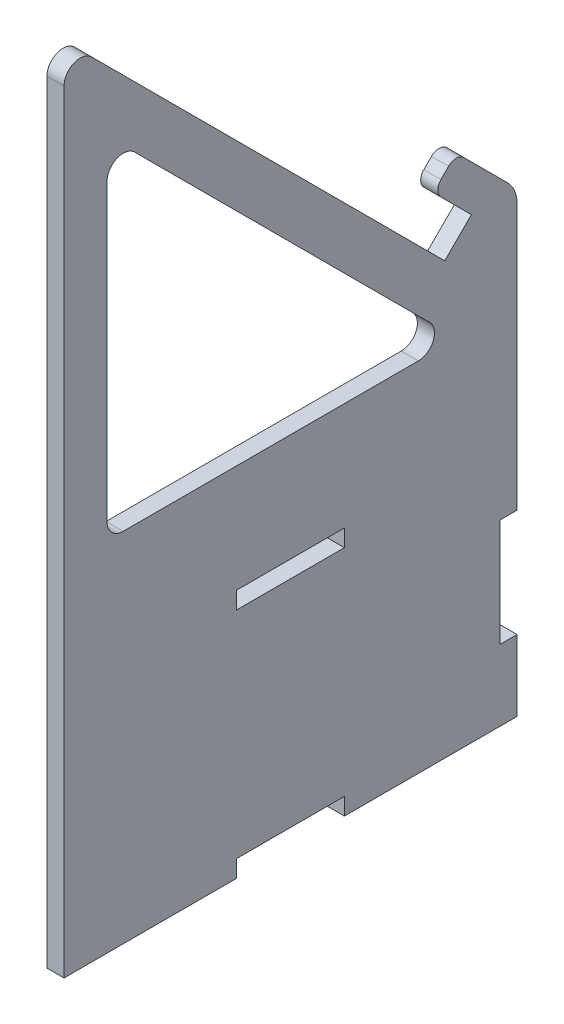
ISO-10303-21;
HEADER;
FILE_DESCRIPTION(('STEP AP214'),'2;1');
FILE_NAME('part.step','',(''),(''),'','','');
FILE_SCHEMA(('AUTOMOTIVE_DESIGN { 1 0 10303 214 1 1 1 1 }'));
ENDSEC;
DATA;
#1=APPLICATION_CONTEXT('core data for automotive mechanical design processes');
#2=APPLICATION_PROTOCOL_DEFINITION('international standard','automotive_design',2000,#1);
#3=PRODUCT_CONTEXT('',#1,'mechanical');
#4=PRODUCT('Part','Part','',(#3));
#5=PRODUCT_RELATED_PRODUCT_CATEGORY('part','',(#4));
#6=PRODUCT_DEFINITION_FORMATION('','',#4);
#7=PRODUCT_DEFINITION_CONTEXT('part definition',#1,'design');
#8=PRODUCT_DEFINITION('design','',#6,#7);
#9=PRODUCT_DEFINITION_SHAPE('','',#8);
#10=(LENGTH_UNIT() NAMED_UNIT(*) SI_UNIT(.MILLI.,.METRE.));
#11=(NAMED_UNIT(*) PLANE_ANGLE_UNIT() SI_UNIT($,.RADIAN.));
#12=(NAMED_UNIT(*) SI_UNIT($,.STERADIAN.) SOLID_ANGLE_UNIT());
#13=UNCERTAINTY_MEASURE_WITH_UNIT(LENGTH_MEASURE(1.E-05),#10,'distance_accuracy_value','');
#14=(GEOMETRIC_REPRESENTATION_CONTEXT(3) GLOBAL_UNCERTAINTY_ASSIGNED_CONTEXT((#13)) GLOBAL_UNIT_ASSIGNED_CONTEXT((#10,
#11,#12)) REPRESENTATION_CONTEXT('',''));
#15=CARTESIAN_POINT('',(0.,0.,0.));
#16=DIRECTION('',(0.,0.,1.));
#17=DIRECTION('',(1.,0.,0.));
#18=AXIS2_PLACEMENT_3D('',#15,#16,#17);
#19=CARTESIAN_POINT('',(3.175,0.,42.0728534805994));
#20=DIRECTION('',(0.,1.,0.));
#21=DIRECTION('',(0.,0.,1.));
#22=AXIS2_PLACEMENT_3D('',#19,#20,#21);
#23=PLANE('',#22);
#24=DIRECTION('',(0.,0.,-1.));
#25=VECTOR('',#24,1.);
#26=CARTESIAN_POINT('',(0.,0.,42.0728534805994));
#27=LINE('',#26,#25);
#28=CARTESIAN_POINT('',(0.,0.,42.0728534805994));
#29=VERTEX_POINT('',#28);
#30=CARTESIAN_POINT('',(0.,0.,10.));
#31=VERTEX_POINT('',#30);
#32=EDGE_CURVE('E255',#29,#31,#27,.T.);
#33=ORIENTED_EDGE('',*,*,#32,.T.);
#34=DIRECTION('',(1.,0.,0.));
#35=VECTOR('',#34,1.);
#36=CARTESIAN_POINT('',(0.,0.,10.));
#37=LINE('',#36,#35);
#38=CARTESIAN_POINT('',(3.175,0.,10.));
#39=VERTEX_POINT('',#38);
#40=EDGE_CURVE('E238',#31,#39,#37,.T.);
#41=ORIENTED_EDGE('',*,*,#40,.T.);
#42=DIRECTION('',(0.,0.,-1.));
#43=VECTOR('',#42,1.);
#44=CARTESIAN_POINT('',(3.175,0.,42.0728534805994));
#45=LINE('',#44,#43);
#46=CARTESIAN_POINT('',(3.175,0.,42.0728534805994));
#47=VERTEX_POINT('',#46);
#48=EDGE_CURVE('E545',#47,#39,#45,.T.);
#49=ORIENTED_EDGE('',*,*,#48,.F.);
#50=DIRECTION('',(-1.,0.,0.));
#51=VECTOR('',#50,1.);
#52=CARTESIAN_POINT('',(3.175,0.,42.0728534805994));
#53=LINE('',#52,#51);
#54=EDGE_CURVE('E263',#47,#29,#53,.T.);
#55=ORIENTED_EDGE('',*,*,#54,.T.);
#56=EDGE_LOOP('',(#33,#41,#49,#55));
#57=FACE_BOUND('',#56,.T.);
#58=ADVANCED_FACE('F39',(#57),#23,.F.);
#59=CARTESIAN_POINT('',(3.175,0.,-42.0728534805994));
#60=DIRECTION('',(0.,0.,1.));
#61=DIRECTION('',(0.,-1.,0.));
#62=AXIS2_PLACEMENT_3D('',#59,#60,#61);
#63=PLANE('',#62);
#64=DIRECTION('',(0.,1.,0.));
#65=VECTOR('',#64,1.);
#66=CARTESIAN_POINT('',(0.,0.,-42.0728534805994));
#67=LINE('',#66,#65);
#68=CARTESIAN_POINT('',(0.,0.,-42.0728534805994));
#69=VERTEX_POINT('',#68);
#70=CARTESIAN_POINT('',(0.,13.175,-42.0728534805994));
#71=VERTEX_POINT('',#70);
#72=EDGE_CURVE('E271',#69,#71,#67,.T.);
#73=ORIENTED_EDGE('',*,*,#72,.T.);
#74=DIRECTION('',(1.,0.,0.));
#75=VECTOR('',#74,1.);
#76=CARTESIAN_POINT('',(0.,13.175,-42.0728534805994));
#77=LINE('',#76,#75);
#78=CARTESIAN_POINT('',(3.175,13.175,-42.0728534805994));
#79=VERTEX_POINT('',#78);
#80=EDGE_CURVE('E486',#71,#79,#77,.T.);
#81=ORIENTED_EDGE('',*,*,#80,.T.);
#82=DIRECTION('',(0.,1.,0.));
#83=VECTOR('',#82,1.);
#84=CARTESIAN_POINT('',(3.175,0.,-42.0728534805994));
#85=LINE('',#84,#83);
#86=CARTESIAN_POINT('',(3.175,0.,-42.0728534805994));
#87=VERTEX_POINT('',#86);
#88=EDGE_CURVE('E549',#87,#79,#85,.T.);
#89=ORIENTED_EDGE('',*,*,#88,.F.);
#90=DIRECTION('',(-1.,0.,0.));
#91=VECTOR('',#90,1.);
#92=CARTESIAN_POINT('',(3.175,0.,-42.0728534805994));
#93=LINE('',#92,#91);
#94=EDGE_CURVE('E306',#87,#69,#93,.T.);
#95=ORIENTED_EDGE('',*,*,#94,.T.);
#96=EDGE_LOOP('',(#73,#81,#89,#95));
#97=FACE_BOUND('',#96,.T.);
#98=ADVANCED_FACE('F593',(#97),#63,.F.);
#99=CARTESIAN_POINT('',(3.175,150.710678118654,42.0728534805994));
#100=DIRECTION('',(0.,0.,-1.));
#101=DIRECTION('',(0.,1.,0.));
#102=AXIS2_PLACEMENT_3D('',#99,#100,#101);
#103=PLANE('',#102);
#104=DIRECTION('',(0.,-1.,0.));
#105=VECTOR('',#104,1.);
#106=CARTESIAN_POINT('',(3.175,150.710678118654,42.0728534805994));
#107=LINE('',#106,#105);
#108=CARTESIAN_POINT('',(3.175,143.468037431535,42.0728534805994));
#109=VERTEX_POINT('',#108);
#110=EDGE_CURVE('E296',#109,#47,#107,.T.);
#111=ORIENTED_EDGE('',*,*,#110,.F.);
#112=DIRECTION('',(-1.,0.,0.));
#113=VECTOR('',#112,1.);
#114=CARTESIAN_POINT('',(3.175,143.468037431535,42.0728534805994));
#115=LINE('',#114,#113);
#116=CARTESIAN_POINT('',(0.,143.468037431535,42.0728534805994));
#117=VERTEX_POINT('',#116);
#118=EDGE_CURVE('E372',#109,#117,#115,.T.);
#119=ORIENTED_EDGE('',*,*,#118,.T.);
#120=DIRECTION('',(0.,-1.,0.));
#121=VECTOR('',#120,1.);
#122=CARTESIAN_POINT('',(0.,150.710678118654,42.0728534805994));
#123=LINE('',#122,#121);
#124=EDGE_CURVE('E273',#117,#29,#123,.T.);
#125=ORIENTED_EDGE('',*,*,#124,.T.);
#126=ORIENTED_EDGE('',*,*,#54,.F.);
#127=EDGE_LOOP('',(#111,#119,#125,#126));
#128=FACE_BOUND('',#127,.T.);
#129=ADVANCED_FACE('F575',(#128),#103,.F.);
#130=CARTESIAN_POINT('',(3.175,0.,-10.));
#131=VERTEX_POINT('',#130);
#132=EDGE_CURVE('E544',#131,#87,#45,.T.);
#133=ORIENTED_EDGE('',*,*,#132,.F.);
#134=DIRECTION('',(1.,0.,0.));
#135=VECTOR('',#134,1.);
#136=CARTESIAN_POINT('',(0.,0.,-10.));
#137=LINE('',#136,#135);
#138=CARTESIAN_POINT('',(0.,0.,-10.));
#139=VERTEX_POINT('',#138);
#140=EDGE_CURVE('E250',#139,#131,#137,.T.);
#141=ORIENTED_EDGE('',*,*,#140,.F.);
#142=EDGE_CURVE('E266',#139,#69,#27,.T.);
#143=ORIENTED_EDGE('',*,*,#142,.T.);
#144=ORIENTED_EDGE('',*,*,#94,.F.);
#145=EDGE_LOOP('',(#133,#141,#143,#144));
#146=FACE_BOUND('',#145,.T.);
#147=ADVANCED_FACE('F588',(#146),#23,.F.);
#148=CARTESIAN_POINT('',(0.,33.175,-42.0728534805994));
#149=VERTEX_POINT('',#148);
#150=CARTESIAN_POINT('',(0.,82.4644660940667,-42.0728534805994));
#151=VERTEX_POINT('',#150);
#152=EDGE_CURVE('E265',#149,#151,#67,.T.);
#153=ORIENTED_EDGE('',*,*,#152,.T.);
#154=DIRECTION('',(-1.,0.,0.));
#155=VECTOR('',#154,1.);
#156=CARTESIAN_POINT('',(3.175,82.4644660940667,-42.0728534805994));
#157=LINE('',#156,#155);
#158=CARTESIAN_POINT('',(3.175,82.4644660940667,-42.0728534805994));
#159=VERTEX_POINT('',#158);
#160=EDGE_CURVE('E319',#151,#159,#157,.F.);
#161=ORIENTED_EDGE('',*,*,#160,.T.);
#162=CARTESIAN_POINT('',(3.175,33.175,-42.0728534805994));
#163=VERTEX_POINT('',#162);
#164=EDGE_CURVE('E548',#163,#159,#85,.T.);
#165=ORIENTED_EDGE('',*,*,#164,.F.);
#166=DIRECTION('',(1.,0.,0.));
#167=VECTOR('',#166,1.);
#168=CARTESIAN_POINT('',(0.,33.175,-42.0728534805994));
#169=LINE('',#168,#167);
#170=EDGE_CURVE('E521',#149,#163,#169,.T.);
#171=ORIENTED_EDGE('',*,*,#170,.F.);
#172=EDGE_LOOP('',(#153,#161,#165,#171));
#173=FACE_BOUND('',#172,.T.);
#174=ADVANCED_FACE('F652',(#173),#63,.F.);
#175=CARTESIAN_POINT('',(3.175,84.9497474683053,-42.0728534805994));
#176=DIRECTION('',(0.,-0.707106781186558,0.707106781186537));
#177=DIRECTION('',(0.,-0.707106781186537,-0.707106781186558));
#178=AXIS2_PLACEMENT_3D('',#175,#176,#177);
#179=PLANE('',#178);
#180=DIRECTION('',(0.,0.707106781186537,0.707106781186558));
#181=VECTOR('',#180,1.);
#182=CARTESIAN_POINT('',(0.,84.9497474683053,-42.0728534805994));
#183=LINE('',#182,#181);
#184=CARTESIAN_POINT('',(0.,86.707106781186,-40.3154941677186));
#185=VERTEX_POINT('',#184);
#186=CARTESIAN_POINT('',(0.,94.8492424049166,-32.1733585439878));
#187=VERTEX_POINT('',#186);
#188=EDGE_CURVE('E279',#185,#187,#183,.T.);
#189=ORIENTED_EDGE('',*,*,#188,.T.);
#190=DIRECTION('',(-1.,0.,0.));
#191=VECTOR('',#190,1.);
#192=CARTESIAN_POINT('',(3.175,94.8492424049166,-32.1733585439878));
#193=LINE('',#192,#191);
#194=CARTESIAN_POINT('',(3.175,94.8492424049166,-32.1733585439878));
#195=VERTEX_POINT('',#194);
#196=EDGE_CURVE('E348',#187,#195,#193,.F.);
#197=ORIENTED_EDGE('',*,*,#196,.T.);
#198=DIRECTION('',(0.,0.707106781186537,0.707106781186558));
#199=VECTOR('',#198,1.);
#200=CARTESIAN_POINT('',(3.175,84.9497474683053,-42.0728534805994));
#201=LINE('',#200,#199);
#202=CARTESIAN_POINT('',(3.175,86.707106781186,-40.3154941677186));
#203=VERTEX_POINT('',#202);
#204=EDGE_CURVE('E553',#203,#195,#201,.T.);
#205=ORIENTED_EDGE('',*,*,#204,.F.);
#206=DIRECTION('',(-1.,0.,0.));
#207=VECTOR('',#206,1.);
#208=CARTESIAN_POINT('',(3.175,86.707106781186,-40.3154941677186));
#209=LINE('',#208,#207);
#210=EDGE_CURVE('E312',#203,#185,#209,.T.);
#211=ORIENTED_EDGE('',*,*,#210,.T.);
#212=EDGE_LOOP('',(#189,#197,#205,#211));
#213=FACE_BOUND('',#212,.T.);
#214=ADVANCED_FACE('F612',(#213),#179,.F.);
#215=CARTESIAN_POINT('',(3.175,96.2634559672896,-30.7591449816147));
#216=DIRECTION('',(0.,-0.70710678118655,-0.707106781186545));
#217=DIRECTION('',(0.,0.707106781186545,-0.70710678118655));
#218=AXIS2_PLACEMENT_3D('',#215,#216,#217);
#219=PLANE('',#218);
#220=DIRECTION('',(0.,-0.707106781186545,0.70710678118655));
#221=VECTOR('',#220,1.);
#222=CARTESIAN_POINT('',(0.,96.2634559672896,-30.7591449816147));
#223=LINE('',#222,#221);
#224=CARTESIAN_POINT('',(0.,94.8492424049166,-29.3449314192416));
#225=VERTEX_POINT('',#224);
#226=CARTESIAN_POINT('',(0.,93.4350288425435,-27.9307178568685));
#227=VERTEX_POINT('',#226);
#228=EDGE_CURVE('E283',#225,#227,#223,.T.);
#229=ORIENTED_EDGE('',*,*,#228,.T.);
#230=DIRECTION('',(-1.,0.,0.));
#231=VECTOR('',#230,1.);
#232=CARTESIAN_POINT('',(3.175,93.4350288425435,-27.9307178568685));
#233=LINE('',#232,#231);
#234=CARTESIAN_POINT('',(3.175,93.4350288425435,-27.9307178568685));
#235=VERTEX_POINT('',#234);
#236=EDGE_CURVE('E339',#227,#235,#233,.F.);
#237=ORIENTED_EDGE('',*,*,#236,.T.);
#238=DIRECTION('',(0.,-0.707106781186545,0.70710678118655));
#239=VECTOR('',#238,1.);
#240=CARTESIAN_POINT('',(3.175,96.2634559672896,-30.7591449816147));
#241=LINE('',#240,#239);
#242=CARTESIAN_POINT('',(3.175,94.8492424049166,-29.3449314192416));
#243=VERTEX_POINT('',#242);
#244=EDGE_CURVE('E557',#243,#235,#241,.T.);
#245=ORIENTED_EDGE('',*,*,#244,.F.);
#246=DIRECTION('',(-1.,0.,0.));
#247=VECTOR('',#246,1.);
#248=CARTESIAN_POINT('',(3.175,94.8492424049166,-29.3449314192416));
#249=LINE('',#248,#247);
#250=EDGE_CURVE('E335',#243,#225,#249,.T.);
#251=ORIENTED_EDGE('',*,*,#250,.T.);
#252=EDGE_LOOP('',(#229,#237,#245,#251));
#253=FACE_BOUND('',#252,.T.);
#254=ADVANCED_FACE('F622',(#253),#219,.F.);
#255=CARTESIAN_POINT('',(3.175,92.0208152801704,-26.5165042944954));
#256=DIRECTION('',(0.,0.707106781186544,-0.707106781186551));
#257=DIRECTION('',(0.,0.707106781186551,0.707106781186544));
#258=AXIS2_PLACEMENT_3D('',#255,#256,#257);
#259=PLANE('',#258);
#260=DIRECTION('',(0.,-0.707106781186551,-0.707106781186544));
#261=VECTOR('',#260,1.);
#262=CARTESIAN_POINT('',(3.175,92.0208152801704,-26.5165042944954));
#263=LINE('',#262,#261);
#264=CARTESIAN_POINT('',(3.175,90.6066017177973,-27.9307178568685));
#265=VERTEX_POINT('',#264);
#266=CARTESIAN_POINT('',(3.175,84.9497474683049,-33.5875721063609));
#267=VERTEX_POINT('',#266);
#268=EDGE_CURVE('E561',#265,#267,#263,.T.);
#269=ORIENTED_EDGE('',*,*,#268,.F.);
#270=DIRECTION('',(-1.,0.,0.));
#271=VECTOR('',#270,1.);
#272=CARTESIAN_POINT('',(3.175,90.6066017177973,-27.9307178568685));
#273=LINE('',#272,#271);
#274=CARTESIAN_POINT('',(0.,90.6066017177973,-27.9307178568685));
#275=VERTEX_POINT('',#274);
#276=EDGE_CURVE('E325',#265,#275,#273,.T.);
#277=ORIENTED_EDGE('',*,*,#276,.T.);
#278=DIRECTION('',(0.,-0.707106781186551,-0.707106781186544));
#279=VECTOR('',#278,1.);
#280=CARTESIAN_POINT('',(0.,92.0208152801704,-26.5165042944954));
#281=LINE('',#280,#279);
#282=CARTESIAN_POINT('',(0.,84.9497474683049,-33.5875721063609));
#283=VERTEX_POINT('',#282);
#284=EDGE_CURVE('E287',#275,#283,#281,.T.);
#285=ORIENTED_EDGE('',*,*,#284,.T.);
#286=DIRECTION('',(-1.,0.,0.));
#287=VECTOR('',#286,1.);
#288=CARTESIAN_POINT('',(3.175,84.9497474683049,-33.5875721063609));
#289=LINE('',#288,#287);
#290=EDGE_CURVE('E301',#267,#283,#289,.T.);
#291=ORIENTED_EDGE('',*,*,#290,.F.);
#292=EDGE_LOOP('',(#269,#277,#285,#291));
#293=FACE_BOUND('',#292,.T.);
#294=ADVANCED_FACE('F631',(#293),#259,.F.);
#295=CARTESIAN_POINT('',(3.175,84.9497474683049,-33.5875721063609));
#296=DIRECTION('',(0.,-0.707106781186552,-0.707106781186543));
#297=DIRECTION('',(0.,0.707106781186543,-0.707106781186552));
#298=AXIS2_PLACEMENT_3D('',#295,#296,#297);
#299=PLANE('',#298);
#300=DIRECTION('',(0.,-0.707106781186543,0.707106781186552));
#301=VECTOR('',#300,1.);
#302=CARTESIAN_POINT('',(0.,84.9497474683049,-33.5875721063609));
#303=LINE('',#302,#301);
#304=CARTESIAN_POINT('',(0.,79.9999999999991,-28.637824638055));
#305=VERTEX_POINT('',#304);
#306=EDGE_CURVE('E290',#283,#305,#303,.T.);
#307=ORIENTED_EDGE('',*,*,#306,.T.);
#308=DIRECTION('',(-1.,0.,0.));
#309=VECTOR('',#308,1.);
#310=CARTESIAN_POINT('',(3.175,79.9999999999991,-28.637824638055));
#311=LINE('',#310,#309);
#312=CARTESIAN_POINT('',(3.175,79.9999999999991,-28.637824638055));
#313=VERTEX_POINT('',#312);
#314=EDGE_CURVE('E297',#313,#305,#311,.T.);
#315=ORIENTED_EDGE('',*,*,#314,.F.);
#316=DIRECTION('',(0.,-0.707106781186543,0.707106781186552));
#317=VECTOR('',#316,1.);
#318=CARTESIAN_POINT('',(3.175,84.9497474683049,-33.5875721063609));
#319=LINE('',#318,#317);
#320=EDGE_CURVE('E564',#267,#313,#319,.T.);
#321=ORIENTED_EDGE('',*,*,#320,.F.);
#322=ORIENTED_EDGE('',*,*,#290,.T.);
#323=EDGE_LOOP('',(#307,#315,#321,#322));
#324=FACE_BOUND('',#323,.T.);
#325=ADVANCED_FACE('F635',(#324),#299,.F.);
#326=CARTESIAN_POINT('',(3.175,79.9999999999991,-28.637824638055));
#327=DIRECTION('',(0.,-0.707106781186544,0.707106781186551));
#328=DIRECTION('',(0.,-0.707106781186551,-0.707106781186544));
#329=AXIS2_PLACEMENT_3D('',#326,#327,#328);
#330=PLANE('',#329);
#331=DIRECTION('',(0.,0.707106781186551,0.707106781186544));
#332=VECTOR('',#331,1.);
#333=CARTESIAN_POINT('',(0.,79.9999999999991,-28.637824638055));
#334=LINE('',#333,#332);
#335=CARTESIAN_POINT('',(0.,145.589357775094,36.9515331370397));
#336=VERTEX_POINT('',#335);
#337=EDGE_CURVE('E293',#305,#336,#334,.T.);
#338=ORIENTED_EDGE('',*,*,#337,.T.);
#339=DIRECTION('',(-1.,0.,0.));
#340=VECTOR('',#339,1.);
#341=CARTESIAN_POINT('',(3.175,145.589357775094,36.9515331370397));
#342=LINE('',#341,#340);
#343=CARTESIAN_POINT('',(3.175,145.589357775094,36.9515331370397));
#344=VERTEX_POINT('',#343);
#345=EDGE_CURVE('E55',#336,#344,#342,.F.);
#346=ORIENTED_EDGE('',*,*,#345,.T.);
#347=DIRECTION('',(0.,0.707106781186551,0.707106781186544));
#348=VECTOR('',#347,1.);
#349=CARTESIAN_POINT('',(3.175,79.9999999999991,-28.637824638055));
#350=LINE('',#349,#348);
#351=EDGE_CURVE('E302',#313,#344,#350,.T.);
#352=ORIENTED_EDGE('',*,*,#351,.F.);
#353=ORIENTED_EDGE('',*,*,#314,.T.);
#354=EDGE_LOOP('',(#338,#346,#352,#353));
#355=FACE_BOUND('',#354,.T.);
#356=ADVANCED_FACE('F636',(#355),#330,.F.);
#357=CARTESIAN_POINT('',(3.175,0.,0.));
#358=DIRECTION('',(1.,0.,0.));
#359=DIRECTION('',(0.,0.,-1.));
#360=AXIS2_PLACEMENT_3D('',#357,#358,#359);
#361=PLANE('',#360);
#362=DIRECTION('',(0.,0.707106781186547,0.707106781186548));
#363=VECTOR('',#362,1.);
#364=CARTESIAN_POINT('',(3.175,131.396969619669,34.0728534805994));
#365=LINE('',#364,#363);
#366=CARTESIAN_POINT('',(3.175,71.4713203435597,-25.8527957955097));
#367=VERTEX_POINT('',#366);
#368=CARTESIAN_POINT('',(3.175,126.275649276109,28.9515331370397));
#369=VERTEX_POINT('',#368);
#370=EDGE_CURVE('E401',#367,#369,#365,.T.);
#371=ORIENTED_EDGE('',*,*,#370,.F.);
#372=CARTESIAN_POINT('',(3.175,69.35,-23.73147545195));
#373=DIRECTION('',(1.,0.,0.));
#374=DIRECTION('',(0.,0.,-1.));
#375=AXIS2_PLACEMENT_3D('',#372,#373,#374);
#376=CIRCLE('',#375,3.);
#377=CARTESIAN_POINT('',(3.175,66.35,-23.73147545195));
#378=VERTEX_POINT('',#377);
#379=EDGE_CURVE('E383',#367,#378,#376,.F.);
#380=ORIENTED_EDGE('',*,*,#379,.T.);
#381=DIRECTION('',(0.,0.,-1.));
#382=VECTOR('',#381,1.);
#383=CARTESIAN_POINT('',(3.175,66.35,-30.9741161390693));
#384=LINE('',#383,#382);
#385=CARTESIAN_POINT('',(3.175,66.35,31.0728534805994));
#386=VERTEX_POINT('',#385);
#387=EDGE_CURVE('E434',#386,#378,#384,.T.);
#388=ORIENTED_EDGE('',*,*,#387,.F.);
#389=CARTESIAN_POINT('',(3.175,69.35,31.0728534805994));
#390=DIRECTION('',(1.,0.,0.));
#391=DIRECTION('',(0.,0.,-1.));
#392=AXIS2_PLACEMENT_3D('',#389,#390,#391);
#393=CIRCLE('',#392,3.);
#394=CARTESIAN_POINT('',(3.175,69.35,34.0728534805994));
#395=VERTEX_POINT('',#394);
#396=EDGE_CURVE('E389',#386,#395,#393,.F.);
#397=ORIENTED_EDGE('',*,*,#396,.T.);
#398=DIRECTION('',(0.,-1.,0.));
#399=VECTOR('',#398,1.);
#400=CARTESIAN_POINT('',(3.175,66.35,34.0728534805994));
#401=LINE('',#400,#399);
#402=CARTESIAN_POINT('',(3.175,124.154328932549,34.0728534805994));
#403=VERTEX_POINT('',#402);
#404=EDGE_CURVE('E403',#403,#395,#401,.T.);
#405=ORIENTED_EDGE('',*,*,#404,.F.);
#406=CARTESIAN_POINT('',(3.175,124.154328932549,31.0728534805994));
#407=DIRECTION('',(1.,0.,0.));
#408=DIRECTION('',(0.,0.,-1.));
#409=AXIS2_PLACEMENT_3D('',#406,#407,#408);
#410=CIRCLE('',#409,3.);
#411=EDGE_CURVE('E48',#403,#369,#410,.F.);
#412=ORIENTED_EDGE('',*,*,#411,.T.);
#413=EDGE_LOOP('',(#371,#380,#388,#397,#405,#412));
#414=FACE_BOUND('',#413,.T.);
#415=ORIENTED_EDGE('',*,*,#351,.T.);
#416=CARTESIAN_POINT('',(3.175,143.468037431535,39.0728534805994));
#417=DIRECTION('',(1.,0.,0.));
#418=DIRECTION('',(0.,0.,-1.));
#419=AXIS2_PLACEMENT_3D('',#416,#417,#418);
#420=CIRCLE('',#419,3.);
#421=EDGE_CURVE('E380',#344,#109,#420,.T.);
#422=ORIENTED_EDGE('',*,*,#421,.T.);
#423=ORIENTED_EDGE('',*,*,#110,.T.);
#424=ORIENTED_EDGE('',*,*,#48,.T.);
#425=DIRECTION('',(0.,-1.,0.));
#426=VECTOR('',#425,1.);
#427=CARTESIAN_POINT('',(3.175,0.,10.));
#428=LINE('',#427,#426);
#429=CARTESIAN_POINT('',(3.175,3.175,10.));
#430=VERTEX_POINT('',#429);
#431=EDGE_CURVE('E244',#430,#39,#428,.T.);
#432=ORIENTED_EDGE('',*,*,#431,.F.);
#433=DIRECTION('',(0.,0.,1.));
#434=VECTOR('',#433,1.);
#435=CARTESIAN_POINT('',(3.175,3.175,10.));
#436=LINE('',#435,#434);
#437=CARTESIAN_POINT('',(3.175,3.175,-10.));
#438=VERTEX_POINT('',#437);
#439=EDGE_CURVE('E260',#438,#430,#436,.T.);
#440=ORIENTED_EDGE('',*,*,#439,.F.);
#441=DIRECTION('',(0.,1.,0.));
#442=VECTOR('',#441,1.);
#443=CARTESIAN_POINT('',(3.175,0.,-10.));
#444=LINE('',#443,#442);
#445=EDGE_CURVE('E448',#131,#438,#444,.T.);
#446=ORIENTED_EDGE('',*,*,#445,.F.);
#447=ORIENTED_EDGE('',*,*,#132,.T.);
#448=ORIENTED_EDGE('',*,*,#88,.T.);
#449=DIRECTION('',(0.,0.,-1.));
#450=VECTOR('',#449,1.);
#451=CARTESIAN_POINT('',(3.175,13.175,-42.0728534805994));
#452=LINE('',#451,#450);
#453=CARTESIAN_POINT('',(3.175,13.175,-38.8978534805994));
#454=VERTEX_POINT('',#453);
#455=EDGE_CURVE('E513',#454,#79,#452,.T.);
#456=ORIENTED_EDGE('',*,*,#455,.F.);
#457=DIRECTION('',(0.,-1.,0.));
#458=VECTOR('',#457,1.);
#459=CARTESIAN_POINT('',(3.175,33.175,-38.8978534805994));
#460=LINE('',#459,#458);
#461=CARTESIAN_POINT('',(3.175,33.175,-38.8978534805994));
#462=VERTEX_POINT('',#461);
#463=EDGE_CURVE('E525',#462,#454,#460,.T.);
#464=ORIENTED_EDGE('',*,*,#463,.F.);
#465=DIRECTION('',(0.,0.,1.));
#466=VECTOR('',#465,1.);
#467=CARTESIAN_POINT('',(3.175,33.175,-42.0728534805994));
#468=LINE('',#467,#466);
#469=EDGE_CURVE('E432',#163,#462,#468,.T.);
#470=ORIENTED_EDGE('',*,*,#469,.F.);
#471=ORIENTED_EDGE('',*,*,#164,.T.);
#472=CARTESIAN_POINT('',(3.175,82.4644660940667,-36.0728534805994));
#473=DIRECTION('',(1.,0.,0.));
#474=DIRECTION('',(0.,0.,-1.));
#475=AXIS2_PLACEMENT_3D('',#472,#473,#474);
#476=CIRCLE('',#475,6.);
#477=EDGE_CURVE('E322',#159,#203,#476,.T.);
#478=ORIENTED_EDGE('',*,*,#477,.T.);
#479=ORIENTED_EDGE('',*,*,#204,.T.);
#480=CARTESIAN_POINT('',(3.175,93.4350288425435,-30.7591449816147));
#481=DIRECTION('',(1.,0.,0.));
#482=DIRECTION('',(0.,0.,-1.));
#483=AXIS2_PLACEMENT_3D('',#480,#481,#482);
#484=CIRCLE('',#483,2.);
#485=EDGE_CURVE('E342',#195,#243,#484,.T.);
#486=ORIENTED_EDGE('',*,*,#485,.T.);
#487=ORIENTED_EDGE('',*,*,#244,.T.);
#488=CARTESIAN_POINT('',(3.175,92.0208152801704,-29.3449314192416));
#489=DIRECTION('',(1.,0.,0.));
#490=DIRECTION('',(0.,0.,-1.));
#491=AXIS2_PLACEMENT_3D('',#488,#489,#490);
#492=CIRCLE('',#491,2.);
#493=EDGE_CURVE('E345',#235,#265,#492,.T.);
#494=ORIENTED_EDGE('',*,*,#493,.T.);
#495=ORIENTED_EDGE('',*,*,#268,.T.);
#496=ORIENTED_EDGE('',*,*,#320,.T.);
#497=EDGE_LOOP('',(#415,#422,#423,#424,#432,#440,#446,#447,#448,#456,#464,#470,#471,#478,#479,
#486,#487,#494,#495,#496));
#498=FACE_BOUND('',#497,.T.);
#499=DIRECTION('',(0.,-1.,0.));
#500=VECTOR('',#499,1.);
#501=CARTESIAN_POINT('',(3.175,46.35,10.));
#502=LINE('',#501,#500);
#503=CARTESIAN_POINT('',(3.175,46.35,10.));
#504=VERTEX_POINT('',#503);
#505=CARTESIAN_POINT('',(3.175,43.175,10.));
#506=VERTEX_POINT('',#505);
#507=EDGE_CURVE('E482',#504,#506,#502,.T.);
#508=ORIENTED_EDGE('',*,*,#507,.F.);
#509=DIRECTION('',(0.,0.,1.));
#510=VECTOR('',#509,1.);
#511=CARTESIAN_POINT('',(3.175,46.35,10.));
#512=LINE('',#511,#510);
#513=CARTESIAN_POINT('',(3.175,46.35,-10.));
#514=VERTEX_POINT('',#513);
#515=EDGE_CURVE('E469',#514,#504,#512,.T.);
#516=ORIENTED_EDGE('',*,*,#515,.F.);
#517=DIRECTION('',(0.,1.,0.));
#518=VECTOR('',#517,1.);
#519=CARTESIAN_POINT('',(3.175,46.35,-10.));
#520=LINE('',#519,#518);
#521=CARTESIAN_POINT('',(3.175,43.175,-10.));
#522=VERTEX_POINT('',#521);
#523=EDGE_CURVE('E490',#522,#514,#520,.T.);
#524=ORIENTED_EDGE('',*,*,#523,.F.);
#525=DIRECTION('',(0.,0.,-1.));
#526=VECTOR('',#525,1.);
#527=CARTESIAN_POINT('',(3.175,43.175,10.));
#528=LINE('',#527,#526);
#529=EDGE_CURVE('E485',#506,#522,#528,.T.);
#530=ORIENTED_EDGE('',*,*,#529,.F.);
#531=EDGE_LOOP('',(#508,#516,#524,#530));
#532=FACE_BOUND('',#531,.T.);
#533=ADVANCED_FACE('F399',(#414,#498,#532),#361,.T.);
#534=CARTESIAN_POINT('',(0.,0.,0.));
#535=DIRECTION('',(1.,0.,0.));
#536=DIRECTION('',(0.,0.,-1.));
#537=AXIS2_PLACEMENT_3D('',#534,#535,#536);
#538=PLANE('',#537);
#539=DIRECTION('',(0.,-1.,0.));
#540=VECTOR('',#539,1.);
#541=CARTESIAN_POINT('',(0.,66.35,34.0728534805994));
#542=LINE('',#541,#540);
#543=CARTESIAN_POINT('',(0.,124.154328932549,34.0728534805994));
#544=VERTEX_POINT('',#543);
#545=CARTESIAN_POINT('',(0.,69.35,34.0728534805994));
#546=VERTEX_POINT('',#545);
#547=EDGE_CURVE('E420',#544,#546,#542,.T.);
#548=ORIENTED_EDGE('',*,*,#547,.T.);
#549=CARTESIAN_POINT('',(0.,69.35,31.0728534805994));
#550=DIRECTION('',(1.,0.,0.));
#551=DIRECTION('',(0.,0.,-1.));
#552=AXIS2_PLACEMENT_3D('',#549,#550,#551);
#553=CIRCLE('',#552,3.);
#554=CARTESIAN_POINT('',(0.,66.35,31.0728534805994));
#555=VERTEX_POINT('',#554);
#556=EDGE_CURVE('E392',#546,#555,#553,.T.);
#557=ORIENTED_EDGE('',*,*,#556,.T.);
#558=DIRECTION('',(0.,0.,-1.));
#559=VECTOR('',#558,1.);
#560=CARTESIAN_POINT('',(0.,66.35,-30.9741161390693));
#561=LINE('',#560,#559);
#562=CARTESIAN_POINT('',(0.,66.35,-23.73147545195));
#563=VERTEX_POINT('',#562);
#564=EDGE_CURVE('E427',#555,#563,#561,.T.);
#565=ORIENTED_EDGE('',*,*,#564,.T.);
#566=CARTESIAN_POINT('',(0.,69.35,-23.73147545195));
#567=DIRECTION('',(1.,0.,0.));
#568=DIRECTION('',(0.,0.,-1.));
#569=AXIS2_PLACEMENT_3D('',#566,#567,#568);
#570=CIRCLE('',#569,3.);
#571=CARTESIAN_POINT('',(0.,71.4713203435597,-25.8527957955097));
#572=VERTEX_POINT('',#571);
#573=EDGE_CURVE('E386',#563,#572,#570,.T.);
#574=ORIENTED_EDGE('',*,*,#573,.T.);
#575=DIRECTION('',(0.,0.707106781186547,0.707106781186548));
#576=VECTOR('',#575,1.);
#577=CARTESIAN_POINT('',(0.,131.396969619669,34.0728534805994));
#578=LINE('',#577,#576);
#579=CARTESIAN_POINT('',(0.,126.275649276109,28.9515331370397));
#580=VERTEX_POINT('',#579);
#581=EDGE_CURVE('E422',#572,#580,#578,.T.);
#582=ORIENTED_EDGE('',*,*,#581,.T.);
#583=CARTESIAN_POINT('',(0.,124.154328932549,31.0728534805994));
#584=DIRECTION('',(1.,0.,0.));
#585=DIRECTION('',(0.,0.,-1.));
#586=AXIS2_PLACEMENT_3D('',#583,#584,#585);
#587=CIRCLE('',#586,3.);
#588=EDGE_CURVE('E11',#580,#544,#587,.T.);
#589=ORIENTED_EDGE('',*,*,#588,.T.);
#590=EDGE_LOOP('',(#548,#557,#565,#574,#582,#589));
#591=FACE_BOUND('',#590,.T.);
#592=DIRECTION('',(0.,0.,1.));
#593=VECTOR('',#592,1.);
#594=CARTESIAN_POINT('',(0.,46.35,10.));
#595=LINE('',#594,#593);
#596=CARTESIAN_POINT('',(0.,46.35,-10.));
#597=VERTEX_POINT('',#596);
#598=CARTESIAN_POINT('',(0.,46.35,10.));
#599=VERTEX_POINT('',#598);
#600=EDGE_CURVE('E477',#597,#599,#595,.T.);
#601=ORIENTED_EDGE('',*,*,#600,.T.);
#602=DIRECTION('',(0.,-1.,0.));
#603=VECTOR('',#602,1.);
#604=CARTESIAN_POINT('',(0.,46.35,10.));
#605=LINE('',#604,#603);
#606=CARTESIAN_POINT('',(0.,43.175,10.));
#607=VERTEX_POINT('',#606);
#608=EDGE_CURVE('E464',#599,#607,#605,.T.);
#609=ORIENTED_EDGE('',*,*,#608,.T.);
#610=DIRECTION('',(0.,0.,-1.));
#611=VECTOR('',#610,1.);
#612=CARTESIAN_POINT('',(0.,43.175,10.));
#613=LINE('',#612,#611);
#614=CARTESIAN_POINT('',(0.,43.175,-10.));
#615=VERTEX_POINT('',#614);
#616=EDGE_CURVE('E468',#607,#615,#613,.T.);
#617=ORIENTED_EDGE('',*,*,#616,.T.);
#618=DIRECTION('',(0.,1.,0.));
#619=VECTOR('',#618,1.);
#620=CARTESIAN_POINT('',(0.,46.35,-10.));
#621=LINE('',#620,#619);
#622=EDGE_CURVE('E473',#615,#597,#621,.T.);
#623=ORIENTED_EDGE('',*,*,#622,.T.);
#624=EDGE_LOOP('',(#601,#609,#617,#623));
#625=FACE_BOUND('',#624,.T.);
#626=ORIENTED_EDGE('',*,*,#124,.F.);
#627=CARTESIAN_POINT('',(0.,143.468037431535,39.0728534805994));
#628=DIRECTION('',(1.,0.,0.));
#629=DIRECTION('',(0.,0.,-1.));
#630=AXIS2_PLACEMENT_3D('',#627,#628,#629);
#631=CIRCLE('',#630,3.);
#632=EDGE_CURVE('E63',#117,#336,#631,.F.);
#633=ORIENTED_EDGE('',*,*,#632,.T.);
#634=ORIENTED_EDGE('',*,*,#337,.F.);
#635=ORIENTED_EDGE('',*,*,#306,.F.);
#636=ORIENTED_EDGE('',*,*,#284,.F.);
#637=CARTESIAN_POINT('',(0.,92.0208152801704,-29.3449314192416));
#638=DIRECTION('',(1.,0.,0.));
#639=DIRECTION('',(0.,0.,-1.));
#640=AXIS2_PLACEMENT_3D('',#637,#638,#639);
#641=CIRCLE('',#640,2.);
#642=EDGE_CURVE('E332',#275,#227,#641,.F.);
#643=ORIENTED_EDGE('',*,*,#642,.T.);
#644=ORIENTED_EDGE('',*,*,#228,.F.);
#645=CARTESIAN_POINT('',(0.,93.4350288425435,-30.7591449816147));
#646=DIRECTION('',(1.,0.,0.));
#647=DIRECTION('',(0.,0.,-1.));
#648=AXIS2_PLACEMENT_3D('',#645,#646,#647);
#649=CIRCLE('',#648,2.);
#650=EDGE_CURVE('E329',#225,#187,#649,.F.);
#651=ORIENTED_EDGE('',*,*,#650,.T.);
#652=ORIENTED_EDGE('',*,*,#188,.F.);
#653=CARTESIAN_POINT('',(0.,82.4644660940667,-36.0728534805994));
#654=DIRECTION('',(1.,0.,0.));
#655=DIRECTION('',(0.,0.,-1.));
#656=AXIS2_PLACEMENT_3D('',#653,#654,#655);
#657=CIRCLE('',#656,6.);
#658=EDGE_CURVE('E316',#185,#151,#657,.F.);
#659=ORIENTED_EDGE('',*,*,#658,.T.);
#660=ORIENTED_EDGE('',*,*,#152,.F.);
#661=DIRECTION('',(0.,0.,1.));
#662=VECTOR('',#661,1.);
#663=CARTESIAN_POINT('',(0.,33.175,-42.0728534805994));
#664=LINE('',#663,#662);
#665=CARTESIAN_POINT('',(0.,33.175,-38.8978534805994));
#666=VERTEX_POINT('',#665);
#667=EDGE_CURVE('E508',#149,#666,#664,.T.);
#668=ORIENTED_EDGE('',*,*,#667,.T.);
#669=DIRECTION('',(0.,-1.,0.));
#670=VECTOR('',#669,1.);
#671=CARTESIAN_POINT('',(0.,33.175,-38.8978534805994));
#672=LINE('',#671,#670);
#673=CARTESIAN_POINT('',(0.,13.175,-38.8978534805994));
#674=VERTEX_POINT('',#673);
#675=EDGE_CURVE('E512',#666,#674,#672,.T.);
#676=ORIENTED_EDGE('',*,*,#675,.T.);
#677=DIRECTION('',(0.,0.,-1.));
#678=VECTOR('',#677,1.);
#679=CARTESIAN_POINT('',(0.,13.175,-42.0728534805994));
#680=LINE('',#679,#678);
#681=EDGE_CURVE('E517',#674,#71,#680,.T.);
#682=ORIENTED_EDGE('',*,*,#681,.T.);
#683=ORIENTED_EDGE('',*,*,#72,.F.);
#684=ORIENTED_EDGE('',*,*,#142,.F.);
#685=DIRECTION('',(0.,1.,0.));
#686=VECTOR('',#685,1.);
#687=CARTESIAN_POINT('',(0.,0.,-10.));
#688=LINE('',#687,#686);
#689=CARTESIAN_POINT('',(0.,3.175,-10.));
#690=VERTEX_POINT('',#689);
#691=EDGE_CURVE('E259',#139,#690,#688,.T.);
#692=ORIENTED_EDGE('',*,*,#691,.T.);
#693=DIRECTION('',(0.,0.,1.));
#694=VECTOR('',#693,1.);
#695=CARTESIAN_POINT('',(0.,3.175,10.));
#696=LINE('',#695,#694);
#697=CARTESIAN_POINT('',(0.,3.175,10.));
#698=VERTEX_POINT('',#697);
#699=EDGE_CURVE('E251',#690,#698,#696,.T.);
#700=ORIENTED_EDGE('',*,*,#699,.T.);
#701=DIRECTION('',(0.,-1.,0.));
#702=VECTOR('',#701,1.);
#703=CARTESIAN_POINT('',(0.,0.,10.));
#704=LINE('',#703,#702);
#705=EDGE_CURVE('E241',#698,#31,#704,.T.);
#706=ORIENTED_EDGE('',*,*,#705,.T.);
#707=ORIENTED_EDGE('',*,*,#32,.F.);
#708=EDGE_LOOP('',(#626,#633,#634,#635,#636,#643,#644,#651,#652,#659,#660,#668,#676,#682,#683,
#684,#692,#700,#706,#707));
#709=FACE_BOUND('',#708,.T.);
#710=ADVANCED_FACE('F254',(#591,#625,#709),#538,.F.);
#711=CARTESIAN_POINT('',(0.,13.175,-42.0728534805994));
#712=DIRECTION('',(0.,-1.,0.));
#713=DIRECTION('',(0.,0.,-1.));
#714=AXIS2_PLACEMENT_3D('',#711,#712,#713);
#715=PLANE('',#714);
#716=ORIENTED_EDGE('',*,*,#455,.T.);
#717=ORIENTED_EDGE('',*,*,#80,.F.);
#718=ORIENTED_EDGE('',*,*,#681,.F.);
#719=DIRECTION('',(1.,0.,0.));
#720=VECTOR('',#719,1.);
#721=CARTESIAN_POINT('',(0.,13.175,-38.8978534805994));
#722=LINE('',#721,#720);
#723=EDGE_CURVE('E534',#674,#454,#722,.T.);
#724=ORIENTED_EDGE('',*,*,#723,.T.);
#725=EDGE_LOOP('',(#716,#717,#718,#724));
#726=FACE_BOUND('',#725,.T.);
#727=ADVANCED_FACE('F733',(#726),#715,.F.);
#728=CARTESIAN_POINT('',(0.,33.175,-38.8978534805994));
#729=DIRECTION('',(0.,0.,1.));
#730=DIRECTION('',(0.,-1.,0.));
#731=AXIS2_PLACEMENT_3D('',#728,#729,#730);
#732=PLANE('',#731);
#733=ORIENTED_EDGE('',*,*,#463,.T.);
#734=ORIENTED_EDGE('',*,*,#723,.F.);
#735=ORIENTED_EDGE('',*,*,#675,.F.);
#736=DIRECTION('',(1.,0.,0.));
#737=VECTOR('',#736,1.);
#738=CARTESIAN_POINT('',(0.,33.175,-38.8978534805994));
#739=LINE('',#738,#737);
#740=EDGE_CURVE('E537',#666,#462,#739,.T.);
#741=ORIENTED_EDGE('',*,*,#740,.T.);
#742=EDGE_LOOP('',(#733,#734,#735,#741));
#743=FACE_BOUND('',#742,.T.);
#744=ADVANCED_FACE('F871',(#743),#732,.F.);
#745=CARTESIAN_POINT('',(0.,33.175,-42.0728534805994));
#746=DIRECTION('',(0.,1.,0.));
#747=DIRECTION('',(0.,0.,1.));
#748=AXIS2_PLACEMENT_3D('',#745,#746,#747);
#749=PLANE('',#748);
#750=ORIENTED_EDGE('',*,*,#469,.T.);
#751=ORIENTED_EDGE('',*,*,#740,.F.);
#752=ORIENTED_EDGE('',*,*,#667,.F.);
#753=ORIENTED_EDGE('',*,*,#170,.T.);
#754=EDGE_LOOP('',(#750,#751,#752,#753));
#755=FACE_BOUND('',#754,.T.);
#756=ADVANCED_FACE('F861',(#755),#749,.F.);
#757=CARTESIAN_POINT('',(0.,46.35,10.));
#758=DIRECTION('',(0.,0.,1.));
#759=DIRECTION('',(1.,0.,0.));
#760=AXIS2_PLACEMENT_3D('',#757,#758,#759);
#761=PLANE('',#760);
#762=ORIENTED_EDGE('',*,*,#507,.T.);
#763=DIRECTION('',(1.,0.,0.));
#764=VECTOR('',#763,1.);
#765=CARTESIAN_POINT('',(0.,43.175,10.));
#766=LINE('',#765,#764);
#767=EDGE_CURVE('E481',#607,#506,#766,.T.);
#768=ORIENTED_EDGE('',*,*,#767,.F.);
#769=ORIENTED_EDGE('',*,*,#608,.F.);
#770=DIRECTION('',(1.,0.,0.));
#771=VECTOR('',#770,1.);
#772=CARTESIAN_POINT('',(0.,46.35,10.));
#773=LINE('',#772,#771);
#774=EDGE_CURVE('E449',#599,#504,#773,.T.);
#775=ORIENTED_EDGE('',*,*,#774,.T.);
#776=EDGE_LOOP('',(#762,#768,#769,#775));
#777=FACE_BOUND('',#776,.T.);
#778=ADVANCED_FACE('F851',(#777),#761,.F.);
#779=CARTESIAN_POINT('',(0.,46.35,10.));
#780=DIRECTION('',(0.,1.,0.));
#781=DIRECTION('',(0.,0.,1.));
#782=AXIS2_PLACEMENT_3D('',#779,#780,#781);
#783=PLANE('',#782);
#784=ORIENTED_EDGE('',*,*,#515,.T.);
#785=ORIENTED_EDGE('',*,*,#774,.F.);
#786=ORIENTED_EDGE('',*,*,#600,.F.);
#787=DIRECTION('',(1.,0.,0.));
#788=VECTOR('',#787,1.);
#789=CARTESIAN_POINT('',(0.,46.35,-10.));
#790=LINE('',#789,#788);
#791=EDGE_CURVE('E499',#597,#514,#790,.T.);
#792=ORIENTED_EDGE('',*,*,#791,.T.);
#793=EDGE_LOOP('',(#784,#785,#786,#792));
#794=FACE_BOUND('',#793,.T.);
#795=ADVANCED_FACE('F841',(#794),#783,.F.);
#796=CARTESIAN_POINT('',(0.,46.35,-10.));
#797=DIRECTION('',(0.,0.,-1.));
#798=DIRECTION('',(0.,1.,0.));
#799=AXIS2_PLACEMENT_3D('',#796,#797,#798);
#800=PLANE('',#799);
#801=ORIENTED_EDGE('',*,*,#523,.T.);
#802=ORIENTED_EDGE('',*,*,#791,.F.);
#803=ORIENTED_EDGE('',*,*,#622,.F.);
#804=DIRECTION('',(1.,0.,0.));
#805=VECTOR('',#804,1.);
#806=CARTESIAN_POINT('',(0.,43.175,-10.));
#807=LINE('',#806,#805);
#808=EDGE_CURVE('E502',#615,#522,#807,.T.);
#809=ORIENTED_EDGE('',*,*,#808,.T.);
#810=EDGE_LOOP('',(#801,#802,#803,#809));
#811=FACE_BOUND('',#810,.T.);
#812=ADVANCED_FACE('F831',(#811),#800,.F.);
#813=CARTESIAN_POINT('',(0.,43.175,10.));
#814=DIRECTION('',(0.,-1.,0.));
#815=DIRECTION('',(0.,0.,-1.));
#816=AXIS2_PLACEMENT_3D('',#813,#814,#815);
#817=PLANE('',#816);
#818=ORIENTED_EDGE('',*,*,#529,.T.);
#819=ORIENTED_EDGE('',*,*,#808,.F.);
#820=ORIENTED_EDGE('',*,*,#616,.F.);
#821=ORIENTED_EDGE('',*,*,#767,.T.);
#822=EDGE_LOOP('',(#818,#819,#820,#821));
#823=FACE_BOUND('',#822,.T.);
#824=ADVANCED_FACE('F822',(#823),#817,.F.);
#825=CARTESIAN_POINT('',(0.,0.,10.));
#826=DIRECTION('',(0.,0.,1.));
#827=DIRECTION('',(0.,-1.,0.));
#828=AXIS2_PLACEMENT_3D('',#825,#826,#827);
#829=PLANE('',#828);
#830=ORIENTED_EDGE('',*,*,#431,.T.);
#831=ORIENTED_EDGE('',*,*,#40,.F.);
#832=ORIENTED_EDGE('',*,*,#705,.F.);
#833=DIRECTION('',(1.,0.,0.));
#834=VECTOR('',#833,1.);
#835=CARTESIAN_POINT('',(0.,3.175,10.));
#836=LINE('',#835,#834);
#837=EDGE_CURVE('E456',#698,#430,#836,.T.);
#838=ORIENTED_EDGE('',*,*,#837,.T.);
#839=EDGE_LOOP('',(#830,#831,#832,#838));
#840=FACE_BOUND('',#839,.T.);
#841=ADVANCED_FACE('F240',(#840),#829,.F.);
#842=CARTESIAN_POINT('',(0.,3.175,10.));
#843=DIRECTION('',(0.,1.,0.));
#844=DIRECTION('',(0.,0.,1.));
#845=AXIS2_PLACEMENT_3D('',#842,#843,#844);
#846=PLANE('',#845);
#847=ORIENTED_EDGE('',*,*,#439,.T.);
#848=ORIENTED_EDGE('',*,*,#837,.F.);
#849=ORIENTED_EDGE('',*,*,#699,.F.);
#850=DIRECTION('',(1.,0.,0.));
#851=VECTOR('',#850,1.);
#852=CARTESIAN_POINT('',(0.,3.175,-10.));
#853=LINE('',#852,#851);
#854=EDGE_CURVE('E459',#690,#438,#853,.T.);
#855=ORIENTED_EDGE('',*,*,#854,.T.);
#856=EDGE_LOOP('',(#847,#848,#849,#855));
#857=FACE_BOUND('',#856,.T.);
#858=ADVANCED_FACE('F581',(#857),#846,.F.);
#859=CARTESIAN_POINT('',(0.,0.,-10.));
#860=DIRECTION('',(0.,0.,-1.));
#861=DIRECTION('',(-1.,0.,0.));
#862=AXIS2_PLACEMENT_3D('',#859,#860,#861);
#863=PLANE('',#862);
#864=ORIENTED_EDGE('',*,*,#445,.T.);
#865=ORIENTED_EDGE('',*,*,#854,.F.);
#866=ORIENTED_EDGE('',*,*,#691,.F.);
#867=ORIENTED_EDGE('',*,*,#140,.T.);
#868=EDGE_LOOP('',(#864,#865,#866,#867));
#869=FACE_BOUND('',#868,.T.);
#870=ADVANCED_FACE('F584',(#869),#863,.F.);
#871=CARTESIAN_POINT('',(3.175,82.4644660940667,-36.0728534805994));
#872=DIRECTION('',(-1.,0.,0.));
#873=DIRECTION('',(0.,0.,1.));
#874=AXIS2_PLACEMENT_3D('',#871,#872,#873);
#875=CYLINDRICAL_SURFACE('',#874,6.);
#876=ORIENTED_EDGE('',*,*,#477,.F.);
#877=ORIENTED_EDGE('',*,*,#160,.F.);
#878=ORIENTED_EDGE('',*,*,#658,.F.);
#879=ORIENTED_EDGE('',*,*,#210,.F.);
#880=EDGE_LOOP('',(#876,#877,#878,#879));
#881=FACE_BOUND('',#880,.T.);
#882=ADVANCED_FACE('F609',(#881),#875,.T.);
#883=CARTESIAN_POINT('',(3.175,92.0208152801704,-29.3449314192416));
#884=DIRECTION('',(-1.,0.,0.));
#885=DIRECTION('',(0.,0.,1.));
#886=AXIS2_PLACEMENT_3D('',#883,#884,#885);
#887=CYLINDRICAL_SURFACE('',#886,2.);
#888=ORIENTED_EDGE('',*,*,#493,.F.);
#889=ORIENTED_EDGE('',*,*,#236,.F.);
#890=ORIENTED_EDGE('',*,*,#642,.F.);
#891=ORIENTED_EDGE('',*,*,#276,.F.);
#892=EDGE_LOOP('',(#888,#889,#890,#891));
#893=FACE_BOUND('',#892,.T.);
#894=ADVANCED_FACE('F628',(#893),#887,.T.);
#895=CARTESIAN_POINT('',(3.175,93.4350288425435,-30.7591449816147));
#896=DIRECTION('',(-1.,0.,0.));
#897=DIRECTION('',(0.,0.,1.));
#898=AXIS2_PLACEMENT_3D('',#895,#896,#897);
#899=CYLINDRICAL_SURFACE('',#898,2.);
#900=ORIENTED_EDGE('',*,*,#485,.F.);
#901=ORIENTED_EDGE('',*,*,#196,.F.);
#902=ORIENTED_EDGE('',*,*,#650,.F.);
#903=ORIENTED_EDGE('',*,*,#250,.F.);
#904=EDGE_LOOP('',(#900,#901,#902,#903));
#905=FACE_BOUND('',#904,.T.);
#906=ADVANCED_FACE('F619',(#905),#899,.T.);
#907=CARTESIAN_POINT('',(0.,131.396969619669,34.0728534805994));
#908=DIRECTION('',(0.,0.707106781186548,-0.707106781186547));
#909=DIRECTION('',(0.,0.707106781186547,0.707106781186548));
#910=AXIS2_PLACEMENT_3D('',#907,#908,#909);
#911=PLANE('',#910);
#912=ORIENTED_EDGE('',*,*,#581,.F.);
#913=DIRECTION('',(1.,0.,0.));
#914=VECTOR('',#913,1.);
#915=CARTESIAN_POINT('',(3.175,71.4713203435596,-25.8527957955097));
#916=LINE('',#915,#914);
#917=EDGE_CURVE('E354',#572,#367,#916,.T.);
#918=ORIENTED_EDGE('',*,*,#917,.T.);
#919=ORIENTED_EDGE('',*,*,#370,.T.);
#920=DIRECTION('',(1.,0.,0.));
#921=VECTOR('',#920,1.);
#922=CARTESIAN_POINT('',(0.,126.275649276109,28.9515331370397));
#923=LINE('',#922,#921);
#924=EDGE_CURVE('E351',#369,#580,#923,.F.);
#925=ORIENTED_EDGE('',*,*,#924,.T.);
#926=EDGE_LOOP('',(#912,#918,#919,#925));
#927=FACE_BOUND('',#926,.T.);
#928=ADVANCED_FACE('F409',(#927),#911,.F.);
#929=CARTESIAN_POINT('',(0.,66.35,-30.9741161390693));
#930=DIRECTION('',(0.,-1.,0.));
#931=DIRECTION('',(0.,0.,-1.));
#932=AXIS2_PLACEMENT_3D('',#929,#930,#931);
#933=PLANE('',#932);
#934=ORIENTED_EDGE('',*,*,#387,.T.);
#935=DIRECTION('',(1.,0.,0.));
#936=VECTOR('',#935,1.);
#937=CARTESIAN_POINT('',(0.,66.35,-23.73147545195));
#938=LINE('',#937,#936);
#939=EDGE_CURVE('E362',#378,#563,#938,.F.);
#940=ORIENTED_EDGE('',*,*,#939,.T.);
#941=ORIENTED_EDGE('',*,*,#564,.F.);
#942=DIRECTION('',(1.,0.,0.));
#943=VECTOR('',#942,1.);
#944=CARTESIAN_POINT('',(3.175,66.35,31.0728534805994));
#945=LINE('',#944,#943);
#946=EDGE_CURVE('E358',#555,#386,#945,.T.);
#947=ORIENTED_EDGE('',*,*,#946,.T.);
#948=EDGE_LOOP('',(#934,#940,#941,#947));
#949=FACE_BOUND('',#948,.T.);
#950=ADVANCED_FACE('F706',(#949),#933,.F.);
#951=CARTESIAN_POINT('',(0.,66.35,34.0728534805994));
#952=DIRECTION('',(0.,0.,1.));
#953=DIRECTION('',(1.,0.,0.));
#954=AXIS2_PLACEMENT_3D('',#951,#952,#953);
#955=PLANE('',#954);
#956=ORIENTED_EDGE('',*,*,#404,.T.);
#957=DIRECTION('',(1.,0.,0.));
#958=VECTOR('',#957,1.);
#959=CARTESIAN_POINT('',(0.,69.35,34.0728534805994));
#960=LINE('',#959,#958);
#961=EDGE_CURVE('E369',#395,#546,#960,.F.);
#962=ORIENTED_EDGE('',*,*,#961,.T.);
#963=ORIENTED_EDGE('',*,*,#547,.F.);
#964=DIRECTION('',(1.,0.,0.));
#965=VECTOR('',#964,1.);
#966=CARTESIAN_POINT('',(3.175,124.154328932549,34.0728534805994));
#967=LINE('',#966,#965);
#968=EDGE_CURVE('E365',#544,#403,#967,.T.);
#969=ORIENTED_EDGE('',*,*,#968,.T.);
#970=EDGE_LOOP('',(#956,#962,#963,#969));
#971=FACE_BOUND('',#970,.T.);
#972=ADVANCED_FACE('F424',(#971),#955,.F.);
#973=CARTESIAN_POINT('',(0.,69.35,-23.73147545195));
#974=DIRECTION('',(-1.,0.,0.));
#975=DIRECTION('',(0.,0.,1.));
#976=AXIS2_PLACEMENT_3D('',#973,#974,#975);
#977=CYLINDRICAL_SURFACE('',#976,3.);
#978=ORIENTED_EDGE('',*,*,#573,.F.);
#979=ORIENTED_EDGE('',*,*,#939,.F.);
#980=ORIENTED_EDGE('',*,*,#379,.F.);
#981=ORIENTED_EDGE('',*,*,#917,.F.);
#982=EDGE_LOOP('',(#978,#979,#980,#981));
#983=FACE_BOUND('',#982,.T.);
#984=ADVANCED_FACE('F668',(#983),#977,.F.);
#985=CARTESIAN_POINT('',(0.,69.35,31.0728534805994));
#986=DIRECTION('',(-1.,0.,0.));
#987=DIRECTION('',(0.,0.,1.));
#988=AXIS2_PLACEMENT_3D('',#985,#986,#987);
#989=CYLINDRICAL_SURFACE('',#988,3.);
#990=ORIENTED_EDGE('',*,*,#556,.F.);
#991=ORIENTED_EDGE('',*,*,#961,.F.);
#992=ORIENTED_EDGE('',*,*,#396,.F.);
#993=ORIENTED_EDGE('',*,*,#946,.F.);
#994=EDGE_LOOP('',(#990,#991,#992,#993));
#995=FACE_BOUND('',#994,.T.);
#996=ADVANCED_FACE('F671',(#995),#989,.F.);
#997=CARTESIAN_POINT('',(0.,124.154328932549,31.0728534805994));
#998=DIRECTION('',(-1.,0.,0.));
#999=DIRECTION('',(0.,0.,1.));
#1000=AXIS2_PLACEMENT_3D('',#997,#998,#999);
#1001=CYLINDRICAL_SURFACE('',#1000,3.);
#1002=ORIENTED_EDGE('',*,*,#588,.F.);
#1003=ORIENTED_EDGE('',*,*,#924,.F.);
#1004=ORIENTED_EDGE('',*,*,#411,.F.);
#1005=ORIENTED_EDGE('',*,*,#968,.F.);
#1006=EDGE_LOOP('',(#1002,#1003,#1004,#1005));
#1007=FACE_BOUND('',#1006,.T.);
#1008=ADVANCED_FACE('F415',(#1007),#1001,.F.);
#1009=CARTESIAN_POINT('',(3.175,143.468037431535,39.0728534805994));
#1010=DIRECTION('',(-1.,0.,0.));
#1011=DIRECTION('',(0.,0.,1.));
#1012=AXIS2_PLACEMENT_3D('',#1009,#1010,#1011);
#1013=CYLINDRICAL_SURFACE('',#1012,3.);
#1014=ORIENTED_EDGE('',*,*,#421,.F.);
#1015=ORIENTED_EDGE('',*,*,#345,.F.);
#1016=ORIENTED_EDGE('',*,*,#632,.F.);
#1017=ORIENTED_EDGE('',*,*,#118,.F.);
#1018=EDGE_LOOP('',(#1014,#1015,#1016,#1017));
#1019=FACE_BOUND('',#1018,.T.);
#1020=ADVANCED_FACE('F41',(#1019),#1013,.T.);
#1021=CLOSED_SHELL('',(#58,#98,#129,#147,#174,#214,#254,#294,#325,#356,#533,#710,#727,#744,#756,
#778,#795,#812,#824,#841,#858,#870,#882,#894,#906,#928,#950,#972,#984,#996,#1008,#1020));
#1022=MANIFOLD_SOLID_BREP('B2',#1021);
#1023=ADVANCED_BREP_SHAPE_REPRESENTATION('',(#18,#1022),#14);
#1024=SHAPE_DEFINITION_REPRESENTATION(#9,#1023);
ENDSEC;
END-ISO-10303-21;
